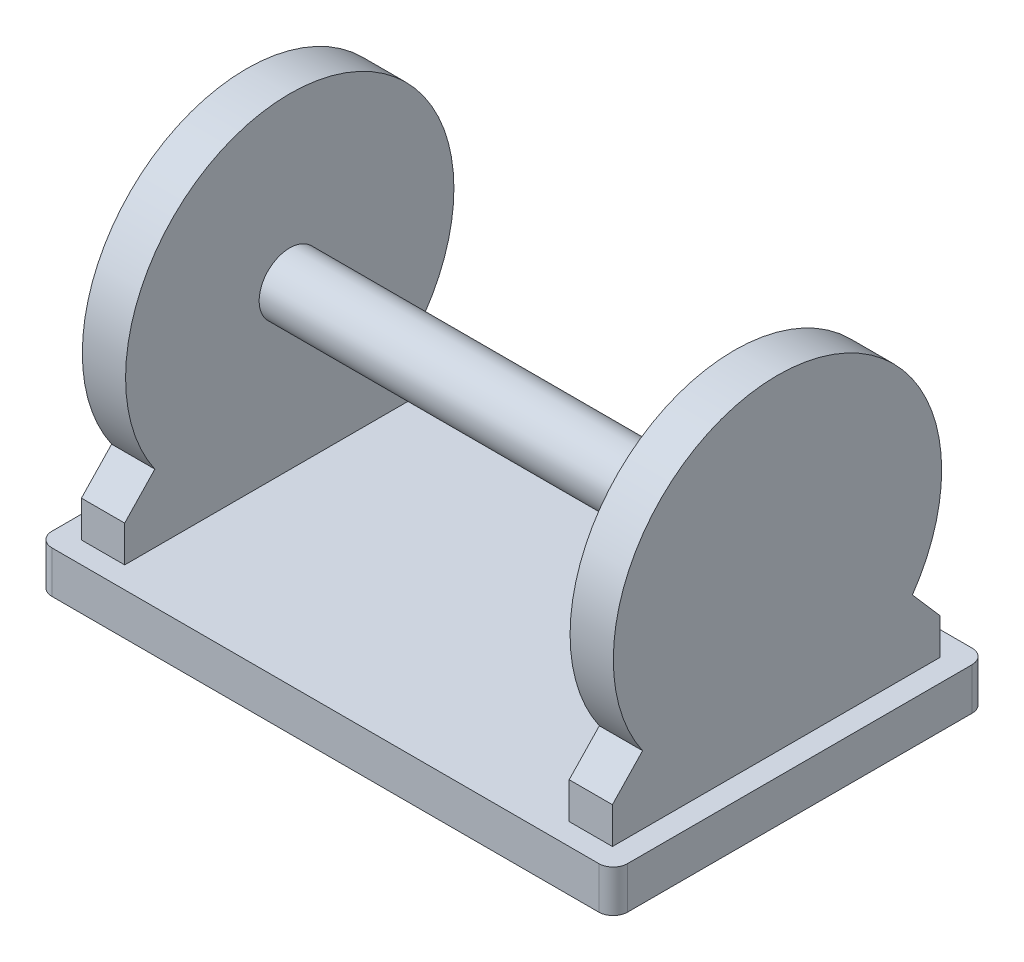
ISO-10303-21;
HEADER;
FILE_DESCRIPTION(('STEP AP214'),'2;1');
FILE_NAME('part.step','',(''),(''),'','','');
FILE_SCHEMA(('AUTOMOTIVE_DESIGN { 1 0 10303 214 1 1 1 1 }'));
ENDSEC;
DATA;
#1=APPLICATION_CONTEXT('core data for automotive mechanical design processes');
#2=APPLICATION_PROTOCOL_DEFINITION('international standard','automotive_design',2000,#1);
#3=PRODUCT_CONTEXT('',#1,'mechanical');
#4=PRODUCT('Part','Part','',(#3));
#5=PRODUCT_RELATED_PRODUCT_CATEGORY('part','',(#4));
#6=PRODUCT_DEFINITION_FORMATION('','',#4);
#7=PRODUCT_DEFINITION_CONTEXT('part definition',#1,'design');
#8=PRODUCT_DEFINITION('design','',#6,#7);
#9=PRODUCT_DEFINITION_SHAPE('','',#8);
#10=(LENGTH_UNIT() NAMED_UNIT(*) SI_UNIT(.MILLI.,.METRE.));
#11=(NAMED_UNIT(*) PLANE_ANGLE_UNIT() SI_UNIT($,.RADIAN.));
#12=(NAMED_UNIT(*) SI_UNIT($,.STERADIAN.) SOLID_ANGLE_UNIT());
#13=UNCERTAINTY_MEASURE_WITH_UNIT(LENGTH_MEASURE(1.E-05),#10,'distance_accuracy_value','');
#14=(GEOMETRIC_REPRESENTATION_CONTEXT(3) GLOBAL_UNCERTAINTY_ASSIGNED_CONTEXT((#13)) GLOBAL_UNIT_ASSIGNED_CONTEXT((#10,
#11,#12)) REPRESENTATION_CONTEXT('',''));
#15=CARTESIAN_POINT('',(0.,0.,0.));
#16=DIRECTION('',(0.,0.,1.));
#17=DIRECTION('',(1.,0.,0.));
#18=AXIS2_PLACEMENT_3D('',#15,#16,#17);
#19=CARTESIAN_POINT('',(-30.84,28.24,0.));
#20=DIRECTION('',(-1.,0.,0.));
#21=DIRECTION('',(0.,0.,1.));
#22=AXIS2_PLACEMENT_3D('',#19,#20,#21);
#23=PLANE('',#22);
#24=DIRECTION('',(0.,-1.,0.));
#25=VECTOR('',#24,1.);
#26=CARTESIAN_POINT('',(-30.84,5.84,-22.543575681325));
#27=LINE('',#26,#25);
#28=CARTESIAN_POINT('',(-30.84,10.87,-22.543575681325));
#29=VERTEX_POINT('',#28);
#30=CARTESIAN_POINT('',(-30.84,5.84,-22.543575681325));
#31=VERTEX_POINT('',#30);
#32=EDGE_CURVE('E222',#29,#31,#27,.T.);
#33=ORIENTED_EDGE('',*,*,#32,.F.);
#34=DIRECTION('',(0.,-0.754101087533607,-0.656758364834914));
#35=VECTOR('',#34,1.);
#36=CARTESIAN_POINT('',(-30.84,15.26,-18.7202564085004));
#37=LINE('',#36,#35);
#38=CARTESIAN_POINT('',(-30.84,15.26,-18.7202564085004));
#39=VERTEX_POINT('',#38);
#40=EDGE_CURVE('E237',#39,#29,#37,.T.);
#41=ORIENTED_EDGE('',*,*,#40,.F.);
#42=CARTESIAN_POINT('',(-30.84,28.24,0.));
#43=DIRECTION('',(-1.,0.,0.));
#44=DIRECTION('',(0.,0.,1.));
#45=AXIS2_PLACEMENT_3D('',#42,#43,#44);
#46=CIRCLE('',#45,22.78);
#47=CARTESIAN_POINT('',(-30.84,15.26,18.7202564085004));
#48=VERTEX_POINT('',#47);
#49=EDGE_CURVE('E234',#48,#39,#46,.T.);
#50=ORIENTED_EDGE('',*,*,#49,.F.);
#51=DIRECTION('',(0.,0.723708401820149,-0.690105897044015));
#52=VECTOR('',#51,1.);
#53=CARTESIAN_POINT('',(-30.84,15.26,18.7202564085004));
#54=LINE('',#53,#52);
#55=CARTESIAN_POINT('',(-30.84,10.87,22.906424318675));
#56=VERTEX_POINT('',#55);
#57=EDGE_CURVE('E231',#56,#48,#54,.T.);
#58=ORIENTED_EDGE('',*,*,#57,.F.);
#59=DIRECTION('',(0.,1.,0.));
#60=VECTOR('',#59,1.);
#61=CARTESIAN_POINT('',(-30.84,5.84,22.906424318675));
#62=LINE('',#61,#60);
#63=CARTESIAN_POINT('',(-30.84,5.84,22.906424318675));
#64=VERTEX_POINT('',#63);
#65=EDGE_CURVE('E228',#64,#56,#62,.T.);
#66=ORIENTED_EDGE('',*,*,#65,.F.);
#67=DIRECTION('',(0.,0.,1.));
#68=VECTOR('',#67,1.);
#69=CARTESIAN_POINT('',(-30.84,5.84,-22.543575681325));
#70=LINE('',#69,#68);
#71=EDGE_CURVE('E225',#31,#64,#70,.T.);
#72=ORIENTED_EDGE('',*,*,#71,.F.);
#73=EDGE_LOOP('',(#33,#41,#50,#58,#66,#72));
#74=FACE_BOUND('',#73,.T.);
#75=CARTESIAN_POINT('',(-30.840000000012,28.24,0.));
#76=DIRECTION('',(-1.,0.,0.));
#77=DIRECTION('',(0.,0.,1.));
#78=AXIS2_PLACEMENT_3D('',#75,#76,#77);
#79=CIRCLE('',#78,4.24948290441005);
#80=CARTESIAN_POINT('',(-30.840000000012,28.24,4.24948290441006));
#81=VERTEX_POINT('',#80);
#82=EDGE_CURVE('E11',#81,#81,#79,.F.);
#83=ORIENTED_EDGE('',*,*,#82,.F.);
#84=EDGE_LOOP('',(#83));
#85=FACE_BOUND('',#84,.T.);
#86=ADVANCED_FACE('F34',(#74,#85),#23,.F.);
#87=CARTESIAN_POINT('',(30.84,28.24,0.));
#88=DIRECTION('',(1.,0.,0.));
#89=DIRECTION('',(0.,0.,1.));
#90=AXIS2_PLACEMENT_3D('',#87,#88,#89);
#91=PLANE('',#90);
#92=DIRECTION('',(0.,-1.,0.));
#93=VECTOR('',#92,1.);
#94=CARTESIAN_POINT('',(30.84,5.84,-22.543575681325));
#95=LINE('',#94,#93);
#96=CARTESIAN_POINT('',(30.84,10.87,-22.543575681325));
#97=VERTEX_POINT('',#96);
#98=CARTESIAN_POINT('',(30.84,5.84,-22.543575681325));
#99=VERTEX_POINT('',#98);
#100=EDGE_CURVE('E173',#97,#99,#95,.T.);
#101=ORIENTED_EDGE('',*,*,#100,.T.);
#102=DIRECTION('',(0.,0.,1.));
#103=VECTOR('',#102,1.);
#104=CARTESIAN_POINT('',(30.84,5.84,-22.543575681325));
#105=LINE('',#104,#103);
#106=CARTESIAN_POINT('',(30.84,5.84,22.906424318675));
#107=VERTEX_POINT('',#106);
#108=EDGE_CURVE('E49',#99,#107,#105,.T.);
#109=ORIENTED_EDGE('',*,*,#108,.T.);
#110=DIRECTION('',(0.,1.,0.));
#111=VECTOR('',#110,1.);
#112=CARTESIAN_POINT('',(30.84,5.84,22.906424318675));
#113=LINE('',#112,#111);
#114=CARTESIAN_POINT('',(30.84,10.87,22.906424318675));
#115=VERTEX_POINT('',#114);
#116=EDGE_CURVE('E201',#107,#115,#113,.T.);
#117=ORIENTED_EDGE('',*,*,#116,.T.);
#118=DIRECTION('',(0.,0.723708401820149,-0.690105897044015));
#119=VECTOR('',#118,1.);
#120=CARTESIAN_POINT('',(30.84,15.26,18.7202564085004));
#121=LINE('',#120,#119);
#122=CARTESIAN_POINT('',(30.84,15.26,18.7202564085004));
#123=VERTEX_POINT('',#122);
#124=EDGE_CURVE('E199',#115,#123,#121,.T.);
#125=ORIENTED_EDGE('',*,*,#124,.T.);
#126=CARTESIAN_POINT('',(30.84,28.24,0.));
#127=DIRECTION('',(-1.,0.,0.));
#128=DIRECTION('',(0.,0.,1.));
#129=AXIS2_PLACEMENT_3D('',#126,#127,#128);
#130=CIRCLE('',#129,22.78);
#131=CARTESIAN_POINT('',(30.84,15.26,-18.7202564085004));
#132=VERTEX_POINT('',#131);
#133=EDGE_CURVE('E176',#123,#132,#130,.T.);
#134=ORIENTED_EDGE('',*,*,#133,.T.);
#135=DIRECTION('',(0.,-0.754101087533607,-0.656758364834914));
#136=VECTOR('',#135,1.);
#137=CARTESIAN_POINT('',(30.84,15.26,-18.7202564085004));
#138=LINE('',#137,#136);
#139=EDGE_CURVE('E168',#132,#97,#138,.T.);
#140=ORIENTED_EDGE('',*,*,#139,.T.);
#141=EDGE_LOOP('',(#101,#109,#117,#125,#134,#140));
#142=FACE_BOUND('',#141,.T.);
#143=CARTESIAN_POINT('',(30.840000000012,28.24,0.));
#144=DIRECTION('',(1.,0.,0.));
#145=DIRECTION('',(0.,0.,-1.));
#146=AXIS2_PLACEMENT_3D('',#143,#144,#145);
#147=CIRCLE('',#146,4.24948290441005);
#148=CARTESIAN_POINT('',(30.840000000012,28.24,-4.24948290441006));
#149=VERTEX_POINT('',#148);
#150=EDGE_CURVE('E42',#149,#149,#147,.F.);
#151=ORIENTED_EDGE('',*,*,#150,.F.);
#152=EDGE_LOOP('',(#151));
#153=FACE_BOUND('',#152,.T.);
#154=ADVANCED_FACE('F170',(#142,#153),#91,.F.);
#155=CARTESIAN_POINT('',(0.,5.84,0.));
#156=DIRECTION('',(0.,1.,0.));
#157=DIRECTION('',(0.,0.,1.));
#158=AXIS2_PLACEMENT_3D('',#155,#156,#157);
#159=PLANE('',#158);
#160=DIRECTION('',(-1.,0.,0.));
#161=VECTOR('',#160,1.);
#162=CARTESIAN_POINT('',(-30.84,5.84,-22.543575681325));
#163=LINE('',#162,#161);
#164=CARTESIAN_POINT('',(-36.84,5.84,-22.543575681325));
#165=VERTEX_POINT('',#164);
#166=EDGE_CURVE('E240',#31,#165,#163,.T.);
#167=ORIENTED_EDGE('',*,*,#166,.F.);
#168=ORIENTED_EDGE('',*,*,#71,.T.);
#169=DIRECTION('',(-1.,0.,0.));
#170=VECTOR('',#169,1.);
#171=CARTESIAN_POINT('',(-30.84,5.84,22.906424318675));
#172=LINE('',#171,#170);
#173=CARTESIAN_POINT('',(-36.84,5.84,22.906424318675));
#174=VERTEX_POINT('',#173);
#175=EDGE_CURVE('E266',#64,#174,#172,.T.);
#176=ORIENTED_EDGE('',*,*,#175,.T.);
#177=DIRECTION('',(0.,0.,1.));
#178=VECTOR('',#177,1.);
#179=CARTESIAN_POINT('',(-36.84,5.84,-22.543575681325));
#180=LINE('',#179,#178);
#181=EDGE_CURVE('E243',#165,#174,#180,.T.);
#182=ORIENTED_EDGE('',*,*,#181,.F.);
#183=EDGE_LOOP('',(#167,#168,#176,#182));
#184=FACE_BOUND('',#183,.T.);
#185=DIRECTION('',(1.,0.,0.));
#186=VECTOR('',#185,1.);
#187=CARTESIAN_POINT('',(-39.94,5.84,25.9));
#188=LINE('',#187,#186);
#189=CARTESIAN_POINT('',(-37.94,5.84,25.9));
#190=VERTEX_POINT('',#189);
#191=CARTESIAN_POINT('',(37.94,5.84,25.9));
#192=VERTEX_POINT('',#191);
#193=EDGE_CURVE('E273',#190,#192,#188,.T.);
#194=ORIENTED_EDGE('',*,*,#193,.T.);
#195=CARTESIAN_POINT('',(37.94,5.84,23.9));
#196=DIRECTION('',(0.,1.,0.));
#197=DIRECTION('',(0.,0.,1.));
#198=AXIS2_PLACEMENT_3D('',#195,#196,#197);
#199=CIRCLE('',#198,2.);
#200=CARTESIAN_POINT('',(39.94,5.84,23.9));
#201=VERTEX_POINT('',#200);
#202=EDGE_CURVE('E327',#192,#201,#199,.T.);
#203=ORIENTED_EDGE('',*,*,#202,.T.);
#204=DIRECTION('',(0.,0.,-1.));
#205=VECTOR('',#204,1.);
#206=CARTESIAN_POINT('',(39.94,5.84,-25.9));
#207=LINE('',#206,#205);
#208=CARTESIAN_POINT('',(39.94,5.84,-23.9));
#209=VERTEX_POINT('',#208);
#210=EDGE_CURVE('E277',#201,#209,#207,.T.);
#211=ORIENTED_EDGE('',*,*,#210,.T.);
#212=CARTESIAN_POINT('',(37.94,5.84,-23.9));
#213=DIRECTION('',(0.,1.,0.));
#214=DIRECTION('',(0.,0.,1.));
#215=AXIS2_PLACEMENT_3D('',#212,#213,#214);
#216=CIRCLE('',#215,2.);
#217=CARTESIAN_POINT('',(37.94,5.84,-25.9));
#218=VERTEX_POINT('',#217);
#219=EDGE_CURVE('E318',#209,#218,#216,.T.);
#220=ORIENTED_EDGE('',*,*,#219,.T.);
#221=DIRECTION('',(-1.,0.,0.));
#222=VECTOR('',#221,1.);
#223=CARTESIAN_POINT('',(-39.94,5.84,-25.9));
#224=LINE('',#223,#222);
#225=CARTESIAN_POINT('',(-37.94,5.84,-25.9));
#226=VERTEX_POINT('',#225);
#227=EDGE_CURVE('E279',#218,#226,#224,.T.);
#228=ORIENTED_EDGE('',*,*,#227,.T.);
#229=CARTESIAN_POINT('',(-37.94,5.84,-23.9));
#230=DIRECTION('',(0.,1.,0.));
#231=DIRECTION('',(0.,0.,1.));
#232=AXIS2_PLACEMENT_3D('',#229,#230,#231);
#233=CIRCLE('',#232,2.);
#234=CARTESIAN_POINT('',(-39.94,5.84,-23.9));
#235=VERTEX_POINT('',#234);
#236=EDGE_CURVE('E298',#226,#235,#233,.T.);
#237=ORIENTED_EDGE('',*,*,#236,.T.);
#238=DIRECTION('',(0.,0.,1.));
#239=VECTOR('',#238,1.);
#240=CARTESIAN_POINT('',(-39.94,5.84,-25.9));
#241=LINE('',#240,#239);
#242=CARTESIAN_POINT('',(-39.94,5.84,23.9));
#243=VERTEX_POINT('',#242);
#244=EDGE_CURVE('E270',#235,#243,#241,.T.);
#245=ORIENTED_EDGE('',*,*,#244,.T.);
#246=CARTESIAN_POINT('',(-37.94,5.84,23.9));
#247=DIRECTION('',(0.,1.,0.));
#248=DIRECTION('',(0.,0.,1.));
#249=AXIS2_PLACEMENT_3D('',#246,#247,#248);
#250=CIRCLE('',#249,2.);
#251=EDGE_CURVE('E307',#243,#190,#250,.T.);
#252=ORIENTED_EDGE('',*,*,#251,.T.);
#253=EDGE_LOOP('',(#194,#203,#211,#220,#228,#237,#245,#252));
#254=FACE_BOUND('',#253,.T.);
#255=DIRECTION('',(1.,0.,0.));
#256=VECTOR('',#255,1.);
#257=CARTESIAN_POINT('',(30.84,5.84,22.906424318675));
#258=LINE('',#257,#256);
#259=CARTESIAN_POINT('',(36.84,5.84,22.906424318675));
#260=VERTEX_POINT('',#259);
#261=EDGE_CURVE('E54',#107,#260,#258,.T.);
#262=ORIENTED_EDGE('',*,*,#261,.F.);
#263=ORIENTED_EDGE('',*,*,#108,.F.);
#264=DIRECTION('',(1.,0.,0.));
#265=VECTOR('',#264,1.);
#266=CARTESIAN_POINT('',(30.84,5.84,-22.543575681325));
#267=LINE('',#266,#265);
#268=CARTESIAN_POINT('',(36.84,5.84,-22.543575681325));
#269=VERTEX_POINT('',#268);
#270=EDGE_CURVE('E192',#99,#269,#267,.T.);
#271=ORIENTED_EDGE('',*,*,#270,.T.);
#272=DIRECTION('',(0.,0.,1.));
#273=VECTOR('',#272,1.);
#274=CARTESIAN_POINT('',(36.84,5.84,-22.543575681325));
#275=LINE('',#274,#273);
#276=EDGE_CURVE('E193',#269,#260,#275,.T.);
#277=ORIENTED_EDGE('',*,*,#276,.T.);
#278=EDGE_LOOP('',(#262,#263,#271,#277));
#279=FACE_BOUND('',#278,.T.);
#280=ADVANCED_FACE('F333',(#184,#254,#279),#159,.T.);
#281=CARTESIAN_POINT('',(-39.94,5.84,-25.9));
#282=DIRECTION('',(1.,0.,0.));
#283=DIRECTION('',(0.,0.,-1.));
#284=AXIS2_PLACEMENT_3D('',#281,#282,#283);
#285=PLANE('',#284);
#286=DIRECTION('',(0.,0.,1.));
#287=VECTOR('',#286,1.);
#288=CARTESIAN_POINT('',(-39.94,0.,-25.9));
#289=LINE('',#288,#287);
#290=CARTESIAN_POINT('',(-39.94,0.,-23.9));
#291=VERTEX_POINT('',#290);
#292=CARTESIAN_POINT('',(-39.94,0.,23.9));
#293=VERTEX_POINT('',#292);
#294=EDGE_CURVE('E259',#291,#293,#289,.T.);
#295=ORIENTED_EDGE('',*,*,#294,.T.);
#296=DIRECTION('',(0.,-1.,0.));
#297=VECTOR('',#296,1.);
#298=CARTESIAN_POINT('',(-39.94,5.84,23.9));
#299=LINE('',#298,#297);
#300=EDGE_CURVE('E305',#293,#243,#299,.F.);
#301=ORIENTED_EDGE('',*,*,#300,.T.);
#302=ORIENTED_EDGE('',*,*,#244,.F.);
#303=DIRECTION('',(0.,-1.,0.));
#304=VECTOR('',#303,1.);
#305=CARTESIAN_POINT('',(-39.94,5.84,-23.9));
#306=LINE('',#305,#304);
#307=EDGE_CURVE('E281',#235,#291,#306,.T.);
#308=ORIENTED_EDGE('',*,*,#307,.T.);
#309=EDGE_LOOP('',(#295,#301,#302,#308));
#310=FACE_BOUND('',#309,.T.);
#311=ADVANCED_FACE('F339',(#310),#285,.F.);
#312=CARTESIAN_POINT('',(-39.94,5.84,25.9));
#313=DIRECTION('',(0.,0.,-1.));
#314=DIRECTION('',(-1.,0.,0.));
#315=AXIS2_PLACEMENT_3D('',#312,#313,#314);
#316=PLANE('',#315);
#317=DIRECTION('',(1.,0.,0.));
#318=VECTOR('',#317,1.);
#319=CARTESIAN_POINT('',(-39.94,0.,25.9));
#320=LINE('',#319,#318);
#321=CARTESIAN_POINT('',(-37.94,0.,25.9));
#322=VERTEX_POINT('',#321);
#323=CARTESIAN_POINT('',(37.94,0.,25.9));
#324=VERTEX_POINT('',#323);
#325=EDGE_CURVE('E284',#322,#324,#320,.T.);
#326=ORIENTED_EDGE('',*,*,#325,.T.);
#327=DIRECTION('',(0.,-1.,0.));
#328=VECTOR('',#327,1.);
#329=CARTESIAN_POINT('',(37.94,5.84,25.9));
#330=LINE('',#329,#328);
#331=EDGE_CURVE('E325',#324,#192,#330,.F.);
#332=ORIENTED_EDGE('',*,*,#331,.T.);
#333=ORIENTED_EDGE('',*,*,#193,.F.);
#334=DIRECTION('',(0.,-1.,0.));
#335=VECTOR('',#334,1.);
#336=CARTESIAN_POINT('',(-37.94,5.84,25.9));
#337=LINE('',#336,#335);
#338=EDGE_CURVE('E300',#190,#322,#337,.T.);
#339=ORIENTED_EDGE('',*,*,#338,.T.);
#340=EDGE_LOOP('',(#326,#332,#333,#339));
#341=FACE_BOUND('',#340,.T.);
#342=ADVANCED_FACE('F403',(#341),#316,.F.);
#343=CARTESIAN_POINT('',(39.94,5.84,-25.9));
#344=DIRECTION('',(-1.,0.,0.));
#345=DIRECTION('',(0.,0.,1.));
#346=AXIS2_PLACEMENT_3D('',#343,#344,#345);
#347=PLANE('',#346);
#348=ORIENTED_EDGE('',*,*,#210,.F.);
#349=DIRECTION('',(0.,-1.,0.));
#350=VECTOR('',#349,1.);
#351=CARTESIAN_POINT('',(39.94,5.84,23.9));
#352=LINE('',#351,#350);
#353=CARTESIAN_POINT('',(39.94,0.,23.9));
#354=VERTEX_POINT('',#353);
#355=EDGE_CURVE('E320',#201,#354,#352,.T.);
#356=ORIENTED_EDGE('',*,*,#355,.T.);
#357=DIRECTION('',(0.,0.,-1.));
#358=VECTOR('',#357,1.);
#359=CARTESIAN_POINT('',(39.94,0.,-25.9));
#360=LINE('',#359,#358);
#361=CARTESIAN_POINT('',(39.94,0.,-23.9));
#362=VERTEX_POINT('',#361);
#363=EDGE_CURVE('E287',#354,#362,#360,.T.);
#364=ORIENTED_EDGE('',*,*,#363,.T.);
#365=DIRECTION('',(0.,-1.,0.));
#366=VECTOR('',#365,1.);
#367=CARTESIAN_POINT('',(39.94,5.84,-23.9));
#368=LINE('',#367,#366);
#369=EDGE_CURVE('E315',#362,#209,#368,.F.);
#370=ORIENTED_EDGE('',*,*,#369,.T.);
#371=EDGE_LOOP('',(#348,#356,#364,#370));
#372=FACE_BOUND('',#371,.T.);
#373=ADVANCED_FACE('F399',(#372),#347,.F.);
#374=CARTESIAN_POINT('',(-39.94,5.84,-25.9));
#375=DIRECTION('',(0.,0.,1.));
#376=DIRECTION('',(1.,0.,0.));
#377=AXIS2_PLACEMENT_3D('',#374,#375,#376);
#378=PLANE('',#377);
#379=ORIENTED_EDGE('',*,*,#227,.F.);
#380=DIRECTION('',(0.,-1.,0.));
#381=VECTOR('',#380,1.);
#382=CARTESIAN_POINT('',(37.94,5.84,-25.9));
#383=LINE('',#382,#381);
#384=CARTESIAN_POINT('',(37.94,0.,-25.9));
#385=VERTEX_POINT('',#384);
#386=EDGE_CURVE('E309',#218,#385,#383,.T.);
#387=ORIENTED_EDGE('',*,*,#386,.T.);
#388=DIRECTION('',(-1.,0.,0.));
#389=VECTOR('',#388,1.);
#390=CARTESIAN_POINT('',(-39.94,0.,-25.9));
#391=LINE('',#390,#389);
#392=CARTESIAN_POINT('',(-37.94,0.,-25.9));
#393=VERTEX_POINT('',#392);
#394=EDGE_CURVE('E274',#385,#393,#391,.T.);
#395=ORIENTED_EDGE('',*,*,#394,.T.);
#396=DIRECTION('',(0.,-1.,0.));
#397=VECTOR('',#396,1.);
#398=CARTESIAN_POINT('',(-37.94,5.84,-25.9));
#399=LINE('',#398,#397);
#400=EDGE_CURVE('E295',#393,#226,#399,.F.);
#401=ORIENTED_EDGE('',*,*,#400,.T.);
#402=EDGE_LOOP('',(#379,#387,#395,#401));
#403=FACE_BOUND('',#402,.T.);
#404=ADVANCED_FACE('F395',(#403),#378,.F.);
#405=CARTESIAN_POINT('',(0.,0.,0.));
#406=DIRECTION('',(0.,1.,0.));
#407=DIRECTION('',(0.,0.,1.));
#408=AXIS2_PLACEMENT_3D('',#405,#406,#407);
#409=PLANE('',#408);
#410=ORIENTED_EDGE('',*,*,#363,.F.);
#411=CARTESIAN_POINT('',(37.94,0.,23.9));
#412=DIRECTION('',(0.,1.,0.));
#413=DIRECTION('',(0.,0.,1.));
#414=AXIS2_PLACEMENT_3D('',#411,#412,#413);
#415=CIRCLE('',#414,2.);
#416=EDGE_CURVE('E323',#354,#324,#415,.F.);
#417=ORIENTED_EDGE('',*,*,#416,.T.);
#418=ORIENTED_EDGE('',*,*,#325,.F.);
#419=CARTESIAN_POINT('',(-37.94,0.,23.9));
#420=DIRECTION('',(0.,1.,0.));
#421=DIRECTION('',(0.,0.,1.));
#422=AXIS2_PLACEMENT_3D('',#419,#420,#421);
#423=CIRCLE('',#422,2.);
#424=EDGE_CURVE('E303',#322,#293,#423,.F.);
#425=ORIENTED_EDGE('',*,*,#424,.T.);
#426=ORIENTED_EDGE('',*,*,#294,.F.);
#427=CARTESIAN_POINT('',(-37.94,0.,-23.9));
#428=DIRECTION('',(0.,1.,0.));
#429=DIRECTION('',(0.,0.,1.));
#430=AXIS2_PLACEMENT_3D('',#427,#428,#429);
#431=CIRCLE('',#430,2.);
#432=EDGE_CURVE('E292',#291,#393,#431,.F.);
#433=ORIENTED_EDGE('',*,*,#432,.T.);
#434=ORIENTED_EDGE('',*,*,#394,.F.);
#435=CARTESIAN_POINT('',(37.94,0.,-23.9));
#436=DIRECTION('',(0.,1.,0.));
#437=DIRECTION('',(0.,0.,1.));
#438=AXIS2_PLACEMENT_3D('',#435,#436,#437);
#439=CIRCLE('',#438,2.);
#440=EDGE_CURVE('E312',#385,#362,#439,.F.);
#441=ORIENTED_EDGE('',*,*,#440,.T.);
#442=EDGE_LOOP('',(#410,#417,#418,#425,#426,#433,#434,#441));
#443=FACE_BOUND('',#442,.T.);
#444=ADVANCED_FACE('F391',(#443),#409,.F.);
#445=CARTESIAN_POINT('',(-37.94,5.84,-23.9));
#446=DIRECTION('',(0.,-1.,0.));
#447=DIRECTION('',(0.,0.,-1.));
#448=AXIS2_PLACEMENT_3D('',#445,#446,#447);
#449=CYLINDRICAL_SURFACE('',#448,2.);
#450=ORIENTED_EDGE('',*,*,#236,.F.);
#451=ORIENTED_EDGE('',*,*,#400,.F.);
#452=ORIENTED_EDGE('',*,*,#432,.F.);
#453=ORIENTED_EDGE('',*,*,#307,.F.);
#454=EDGE_LOOP('',(#450,#451,#452,#453));
#455=FACE_BOUND('',#454,.T.);
#456=ADVANCED_FACE('F394',(#455),#449,.T.);
#457=CARTESIAN_POINT('',(-37.94,5.84,23.9));
#458=DIRECTION('',(0.,-1.,0.));
#459=DIRECTION('',(0.,0.,-1.));
#460=AXIS2_PLACEMENT_3D('',#457,#458,#459);
#461=CYLINDRICAL_SURFACE('',#460,2.);
#462=ORIENTED_EDGE('',*,*,#251,.F.);
#463=ORIENTED_EDGE('',*,*,#300,.F.);
#464=ORIENTED_EDGE('',*,*,#424,.F.);
#465=ORIENTED_EDGE('',*,*,#338,.F.);
#466=EDGE_LOOP('',(#462,#463,#464,#465));
#467=FACE_BOUND('',#466,.T.);
#468=ADVANCED_FACE('F413',(#467),#461,.T.);
#469=CARTESIAN_POINT('',(37.94,5.84,-23.9));
#470=DIRECTION('',(0.,-1.,0.));
#471=DIRECTION('',(0.,0.,-1.));
#472=AXIS2_PLACEMENT_3D('',#469,#470,#471);
#473=CYLINDRICAL_SURFACE('',#472,2.);
#474=ORIENTED_EDGE('',*,*,#219,.F.);
#475=ORIENTED_EDGE('',*,*,#369,.F.);
#476=ORIENTED_EDGE('',*,*,#440,.F.);
#477=ORIENTED_EDGE('',*,*,#386,.F.);
#478=EDGE_LOOP('',(#474,#475,#476,#477));
#479=FACE_BOUND('',#478,.T.);
#480=ADVANCED_FACE('F388',(#479),#473,.T.);
#481=CARTESIAN_POINT('',(-30.84,5.84,-22.543575681325));
#482=DIRECTION('',(0.,0.,-1.));
#483=DIRECTION('',(-1.,0.,0.));
#484=AXIS2_PLACEMENT_3D('',#481,#482,#483);
#485=PLANE('',#484);
#486=DIRECTION('',(0.,-1.,0.));
#487=VECTOR('',#486,1.);
#488=CARTESIAN_POINT('',(-36.84,5.84,-22.543575681325));
#489=LINE('',#488,#487);
#490=CARTESIAN_POINT('',(-36.84,10.87,-22.543575681325));
#491=VERTEX_POINT('',#490);
#492=EDGE_CURVE('E213',#491,#165,#489,.T.);
#493=ORIENTED_EDGE('',*,*,#492,.F.);
#494=DIRECTION('',(-1.,0.,0.));
#495=VECTOR('',#494,1.);
#496=CARTESIAN_POINT('',(-30.84,10.87,-22.543575681325));
#497=LINE('',#496,#495);
#498=EDGE_CURVE('E257',#29,#491,#497,.T.);
#499=ORIENTED_EDGE('',*,*,#498,.F.);
#500=ORIENTED_EDGE('',*,*,#32,.T.);
#501=ORIENTED_EDGE('',*,*,#166,.T.);
#502=EDGE_LOOP('',(#493,#499,#500,#501));
#503=FACE_BOUND('',#502,.T.);
#504=ADVANCED_FACE('F375',(#503),#485,.T.);
#505=CARTESIAN_POINT('',(-30.84,15.26,-18.7202564085004));
#506=DIRECTION('',(0.,0.656758364834914,-0.754101087533607));
#507=DIRECTION('',(0.,0.754101087533608,0.656758364834914));
#508=AXIS2_PLACEMENT_3D('',#505,#506,#507);
#509=PLANE('',#508);
#510=DIRECTION('',(0.,-0.754101087533607,-0.656758364834914));
#511=VECTOR('',#510,1.);
#512=CARTESIAN_POINT('',(-36.84,15.26,-18.7202564085004));
#513=LINE('',#512,#511);
#514=CARTESIAN_POINT('',(-36.84,15.26,-18.7202564085004));
#515=VERTEX_POINT('',#514);
#516=EDGE_CURVE('E226',#515,#491,#513,.T.);
#517=ORIENTED_EDGE('',*,*,#516,.F.);
#518=DIRECTION('',(-1.,0.,0.));
#519=VECTOR('',#518,1.);
#520=CARTESIAN_POINT('',(-30.84,15.26,-18.7202564085004));
#521=LINE('',#520,#519);
#522=EDGE_CURVE('E260',#39,#515,#521,.T.);
#523=ORIENTED_EDGE('',*,*,#522,.F.);
#524=ORIENTED_EDGE('',*,*,#40,.T.);
#525=ORIENTED_EDGE('',*,*,#498,.T.);
#526=EDGE_LOOP('',(#517,#523,#524,#525));
#527=FACE_BOUND('',#526,.T.);
#528=ADVANCED_FACE('F371',(#527),#509,.T.);
#529=CARTESIAN_POINT('',(-30.84,28.24,0.));
#530=DIRECTION('',(-1.,0.,0.));
#531=DIRECTION('',(0.,0.,1.));
#532=AXIS2_PLACEMENT_3D('',#529,#530,#531);
#533=CYLINDRICAL_SURFACE('',#532,22.78);
#534=CARTESIAN_POINT('',(-36.84,28.24,0.));
#535=DIRECTION('',(-1.,0.,0.));
#536=DIRECTION('',(0.,0.,1.));
#537=AXIS2_PLACEMENT_3D('',#534,#535,#536);
#538=CIRCLE('',#537,22.78);
#539=CARTESIAN_POINT('',(-36.84,15.26,18.7202564085004));
#540=VERTEX_POINT('',#539);
#541=EDGE_CURVE('E252',#540,#515,#538,.T.);
#542=ORIENTED_EDGE('',*,*,#541,.F.);
#543=DIRECTION('',(-1.,0.,0.));
#544=VECTOR('',#543,1.);
#545=CARTESIAN_POINT('',(-30.84,15.26,18.7202564085004));
#546=LINE('',#545,#544);
#547=EDGE_CURVE('E262',#48,#540,#546,.T.);
#548=ORIENTED_EDGE('',*,*,#547,.F.);
#549=ORIENTED_EDGE('',*,*,#49,.T.);
#550=ORIENTED_EDGE('',*,*,#522,.T.);
#551=EDGE_LOOP('',(#542,#548,#549,#550));
#552=FACE_BOUND('',#551,.T.);
#553=ADVANCED_FACE('F374',(#552),#533,.T.);
#554=CARTESIAN_POINT('',(-30.84,15.26,18.7202564085004));
#555=DIRECTION('',(0.,0.690105897044015,0.723708401820149));
#556=DIRECTION('',(0.,-0.723708401820149,0.690105897044015));
#557=AXIS2_PLACEMENT_3D('',#554,#555,#556);
#558=PLANE('',#557);
#559=DIRECTION('',(0.,0.723708401820149,-0.690105897044015));
#560=VECTOR('',#559,1.);
#561=CARTESIAN_POINT('',(-36.84,15.26,18.7202564085004));
#562=LINE('',#561,#560);
#563=CARTESIAN_POINT('',(-36.84,10.87,22.906424318675));
#564=VERTEX_POINT('',#563);
#565=EDGE_CURVE('E249',#564,#540,#562,.T.);
#566=ORIENTED_EDGE('',*,*,#565,.F.);
#567=DIRECTION('',(-1.,0.,0.));
#568=VECTOR('',#567,1.);
#569=CARTESIAN_POINT('',(-30.84,10.87,22.906424318675));
#570=LINE('',#569,#568);
#571=EDGE_CURVE('E264',#56,#564,#570,.T.);
#572=ORIENTED_EDGE('',*,*,#571,.F.);
#573=ORIENTED_EDGE('',*,*,#57,.T.);
#574=ORIENTED_EDGE('',*,*,#547,.T.);
#575=EDGE_LOOP('',(#566,#572,#573,#574));
#576=FACE_BOUND('',#575,.T.);
#577=ADVANCED_FACE('F379',(#576),#558,.T.);
#578=CARTESIAN_POINT('',(-30.84,5.84,22.906424318675));
#579=DIRECTION('',(0.,0.,1.));
#580=DIRECTION('',(1.,0.,0.));
#581=AXIS2_PLACEMENT_3D('',#578,#579,#580);
#582=PLANE('',#581);
#583=DIRECTION('',(0.,1.,0.));
#584=VECTOR('',#583,1.);
#585=CARTESIAN_POINT('',(-36.84,5.84,22.906424318675));
#586=LINE('',#585,#584);
#587=EDGE_CURVE('E246',#174,#564,#586,.T.);
#588=ORIENTED_EDGE('',*,*,#587,.F.);
#589=ORIENTED_EDGE('',*,*,#175,.F.);
#590=ORIENTED_EDGE('',*,*,#65,.T.);
#591=ORIENTED_EDGE('',*,*,#571,.T.);
#592=EDGE_LOOP('',(#588,#589,#590,#591));
#593=FACE_BOUND('',#592,.T.);
#594=ADVANCED_FACE('F369',(#593),#582,.T.);
#595=CARTESIAN_POINT('',(-36.84,28.24,0.));
#596=DIRECTION('',(-1.,0.,0.));
#597=DIRECTION('',(0.,0.,1.));
#598=AXIS2_PLACEMENT_3D('',#595,#596,#597);
#599=PLANE('',#598);
#600=ORIENTED_EDGE('',*,*,#492,.T.);
#601=ORIENTED_EDGE('',*,*,#181,.T.);
#602=ORIENTED_EDGE('',*,*,#587,.T.);
#603=ORIENTED_EDGE('',*,*,#565,.T.);
#604=ORIENTED_EDGE('',*,*,#541,.T.);
#605=ORIENTED_EDGE('',*,*,#516,.T.);
#606=EDGE_LOOP('',(#600,#601,#602,#603,#604,#605));
#607=FACE_BOUND('',#606,.T.);
#608=ADVANCED_FACE('F366',(#607),#599,.T.);
#609=CARTESIAN_POINT('',(37.94,5.84,23.9));
#610=DIRECTION('',(0.,-1.,0.));
#611=DIRECTION('',(0.,0.,-1.));
#612=AXIS2_PLACEMENT_3D('',#609,#610,#611);
#613=CYLINDRICAL_SURFACE('',#612,2.);
#614=ORIENTED_EDGE('',*,*,#202,.F.);
#615=ORIENTED_EDGE('',*,*,#331,.F.);
#616=ORIENTED_EDGE('',*,*,#416,.F.);
#617=ORIENTED_EDGE('',*,*,#355,.F.);
#618=EDGE_LOOP('',(#614,#615,#616,#617));
#619=FACE_BOUND('',#618,.T.);
#620=ADVANCED_FACE('F36',(#619),#613,.T.);
#621=CARTESIAN_POINT('',(30.84,5.84,-22.543575681325));
#622=DIRECTION('',(0.,0.,1.));
#623=DIRECTION('',(1.,0.,0.));
#624=AXIS2_PLACEMENT_3D('',#621,#622,#623);
#625=PLANE('',#624);
#626=DIRECTION('',(0.,-1.,0.));
#627=VECTOR('',#626,1.);
#628=CARTESIAN_POINT('',(36.84,5.84,-22.543575681325));
#629=LINE('',#628,#627);
#630=CARTESIAN_POINT('',(36.84,10.87,-22.543575681325));
#631=VERTEX_POINT('',#630);
#632=EDGE_CURVE('E204',#631,#269,#629,.T.);
#633=ORIENTED_EDGE('',*,*,#632,.T.);
#634=ORIENTED_EDGE('',*,*,#270,.F.);
#635=ORIENTED_EDGE('',*,*,#100,.F.);
#636=DIRECTION('',(1.,0.,0.));
#637=VECTOR('',#636,1.);
#638=CARTESIAN_POINT('',(30.84,10.87,-22.543575681325));
#639=LINE('',#638,#637);
#640=EDGE_CURVE('E182',#97,#631,#639,.T.);
#641=ORIENTED_EDGE('',*,*,#640,.T.);
#642=EDGE_LOOP('',(#633,#634,#635,#641));
#643=FACE_BOUND('',#642,.T.);
#644=ADVANCED_FACE('F191',(#643),#625,.F.);
#645=CARTESIAN_POINT('',(30.84,5.84,22.906424318675));
#646=DIRECTION('',(0.,0.,-1.));
#647=DIRECTION('',(-1.,0.,0.));
#648=AXIS2_PLACEMENT_3D('',#645,#646,#647);
#649=PLANE('',#648);
#650=DIRECTION('',(0.,1.,0.));
#651=VECTOR('',#650,1.);
#652=CARTESIAN_POINT('',(36.84,5.84,22.906424318675));
#653=LINE('',#652,#651);
#654=CARTESIAN_POINT('',(36.84,10.87,22.906424318675));
#655=VERTEX_POINT('',#654);
#656=EDGE_CURVE('E195',#260,#655,#653,.T.);
#657=ORIENTED_EDGE('',*,*,#656,.T.);
#658=DIRECTION('',(1.,0.,0.));
#659=VECTOR('',#658,1.);
#660=CARTESIAN_POINT('',(30.84,10.87,22.906424318675));
#661=LINE('',#660,#659);
#662=EDGE_CURVE('E215',#115,#655,#661,.T.);
#663=ORIENTED_EDGE('',*,*,#662,.F.);
#664=ORIENTED_EDGE('',*,*,#116,.F.);
#665=ORIENTED_EDGE('',*,*,#261,.T.);
#666=EDGE_LOOP('',(#657,#663,#664,#665));
#667=FACE_BOUND('',#666,.T.);
#668=ADVANCED_FACE('F350',(#667),#649,.F.);
#669=CARTESIAN_POINT('',(30.84,15.26,18.7202564085004));
#670=DIRECTION('',(0.,-0.690105897044015,-0.723708401820149));
#671=DIRECTION('',(0.,0.723708401820149,-0.690105897044015));
#672=AXIS2_PLACEMENT_3D('',#669,#670,#671);
#673=PLANE('',#672);
#674=DIRECTION('',(0.,0.723708401820149,-0.690105897044015));
#675=VECTOR('',#674,1.);
#676=CARTESIAN_POINT('',(36.84,15.26,18.7202564085004));
#677=LINE('',#676,#675);
#678=CARTESIAN_POINT('',(36.84,15.26,18.7202564085004));
#679=VERTEX_POINT('',#678);
#680=EDGE_CURVE('E209',#655,#679,#677,.T.);
#681=ORIENTED_EDGE('',*,*,#680,.T.);
#682=DIRECTION('',(1.,0.,0.));
#683=VECTOR('',#682,1.);
#684=CARTESIAN_POINT('',(30.84,15.26,18.7202564085004));
#685=LINE('',#684,#683);
#686=EDGE_CURVE('E218',#123,#679,#685,.T.);
#687=ORIENTED_EDGE('',*,*,#686,.F.);
#688=ORIENTED_EDGE('',*,*,#124,.F.);
#689=ORIENTED_EDGE('',*,*,#662,.T.);
#690=EDGE_LOOP('',(#681,#687,#688,#689));
#691=FACE_BOUND('',#690,.T.);
#692=ADVANCED_FACE('F353',(#691),#673,.F.);
#693=CARTESIAN_POINT('',(30.84,28.24,0.));
#694=DIRECTION('',(1.,0.,0.));
#695=DIRECTION('',(0.,0.,-1.));
#696=AXIS2_PLACEMENT_3D('',#693,#694,#695);
#697=CYLINDRICAL_SURFACE('',#696,22.78);
#698=CARTESIAN_POINT('',(36.84,28.24,0.));
#699=DIRECTION('',(-1.,0.,0.));
#700=DIRECTION('',(0.,0.,1.));
#701=AXIS2_PLACEMENT_3D('',#698,#699,#700);
#702=CIRCLE('',#701,22.78);
#703=CARTESIAN_POINT('',(36.84,15.26,-18.7202564085004));
#704=VERTEX_POINT('',#703);
#705=EDGE_CURVE('E207',#679,#704,#702,.T.);
#706=ORIENTED_EDGE('',*,*,#705,.T.);
#707=DIRECTION('',(1.,0.,0.));
#708=VECTOR('',#707,1.);
#709=CARTESIAN_POINT('',(30.84,15.26,-18.7202564085004));
#710=LINE('',#709,#708);
#711=EDGE_CURVE('E189',#132,#704,#710,.T.);
#712=ORIENTED_EDGE('',*,*,#711,.F.);
#713=ORIENTED_EDGE('',*,*,#133,.F.);
#714=ORIENTED_EDGE('',*,*,#686,.T.);
#715=EDGE_LOOP('',(#706,#712,#713,#714));
#716=FACE_BOUND('',#715,.T.);
#717=ADVANCED_FACE('F357',(#716),#697,.T.);
#718=CARTESIAN_POINT('',(30.84,15.26,-18.7202564085004));
#719=DIRECTION('',(0.,-0.656758364834914,0.754101087533607));
#720=DIRECTION('',(0.,-0.754101087533608,-0.656758364834914));
#721=AXIS2_PLACEMENT_3D('',#718,#719,#720);
#722=PLANE('',#721);
#723=DIRECTION('',(0.,-0.754101087533607,-0.656758364834914));
#724=VECTOR('',#723,1.);
#725=CARTESIAN_POINT('',(36.84,15.26,-18.7202564085004));
#726=LINE('',#725,#724);
#727=EDGE_CURVE('E185',#704,#631,#726,.T.);
#728=ORIENTED_EDGE('',*,*,#727,.T.);
#729=ORIENTED_EDGE('',*,*,#640,.F.);
#730=ORIENTED_EDGE('',*,*,#139,.F.);
#731=ORIENTED_EDGE('',*,*,#711,.T.);
#732=EDGE_LOOP('',(#728,#729,#730,#731));
#733=FACE_BOUND('',#732,.T.);
#734=ADVANCED_FACE('F183',(#733),#722,.F.);
#735=CARTESIAN_POINT('',(36.84,28.24,0.));
#736=DIRECTION('',(1.,0.,0.));
#737=DIRECTION('',(0.,0.,1.));
#738=AXIS2_PLACEMENT_3D('',#735,#736,#737);
#739=PLANE('',#738);
#740=ORIENTED_EDGE('',*,*,#632,.F.);
#741=ORIENTED_EDGE('',*,*,#727,.F.);
#742=ORIENTED_EDGE('',*,*,#705,.F.);
#743=ORIENTED_EDGE('',*,*,#680,.F.);
#744=ORIENTED_EDGE('',*,*,#656,.F.);
#745=ORIENTED_EDGE('',*,*,#276,.F.);
#746=EDGE_LOOP('',(#740,#741,#742,#743,#744,#745));
#747=FACE_BOUND('',#746,.T.);
#748=ADVANCED_FACE('F346',(#747),#739,.T.);
#749=CARTESIAN_POINT('',(500000.,28.24,-6.69777403852049E-11));
#750=DIRECTION('',(-1.,0.,0.));
#751=DIRECTION('',(0.,0.,1.));
#752=AXIS2_PLACEMENT_3D('',#749,#750,#751);
#753=CYLINDRICAL_SURFACE('',#752,4.24948290441005);
#754=ORIENTED_EDGE('',*,*,#82,.T.);
#755=EDGE_LOOP('',(#754));
#756=FACE_BOUND('',#755,.T.);
#757=ORIENTED_EDGE('',*,*,#150,.T.);
#758=EDGE_LOOP('',(#757));
#759=FACE_BOUND('',#758,.T.);
#760=ADVANCED_FACE('F331',(#756,#759),#753,.T.);
#761=CLOSED_SHELL('',(#86,#154,#280,#311,#342,#373,#404,#444,#456,#468,#480,#504,#528,#553,#577,
#594,#608,#620,#644,#668,#692,#717,#734,#748,#760));
#762=MANIFOLD_SOLID_BREP('B2',#761);
#763=ADVANCED_BREP_SHAPE_REPRESENTATION('',(#18,#762),#14);
#764=SHAPE_DEFINITION_REPRESENTATION(#9,#763);
ENDSEC;
END-ISO-10303-21;
